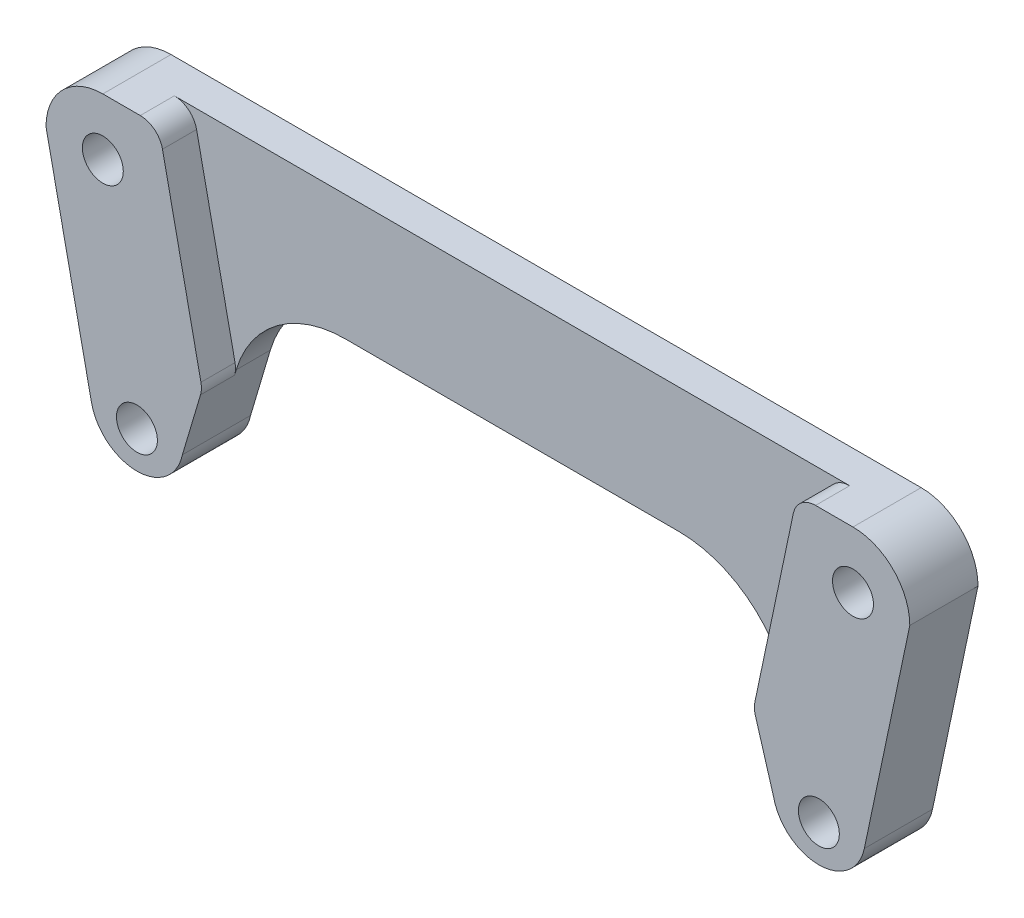
ISO-10303-21;
HEADER;
FILE_DESCRIPTION(('STEP AP214'),'2;1');
FILE_NAME('part.step','',(''),(''),'','','');
FILE_SCHEMA(('AUTOMOTIVE_DESIGN { 1 0 10303 214 1 1 1 1 }'));
ENDSEC;
DATA;
#1=APPLICATION_CONTEXT('core data for automotive mechanical design processes');
#2=APPLICATION_PROTOCOL_DEFINITION('international standard','automotive_design',2000,#1);
#3=PRODUCT_CONTEXT('',#1,'mechanical');
#4=PRODUCT('Part','Part','',(#3));
#5=PRODUCT_RELATED_PRODUCT_CATEGORY('part','',(#4));
#6=PRODUCT_DEFINITION_FORMATION('','',#4);
#7=PRODUCT_DEFINITION_CONTEXT('part definition',#1,'design');
#8=PRODUCT_DEFINITION('design','',#6,#7);
#9=PRODUCT_DEFINITION_SHAPE('','',#8);
#10=(LENGTH_UNIT() NAMED_UNIT(*) SI_UNIT(.MILLI.,.METRE.));
#11=(NAMED_UNIT(*) PLANE_ANGLE_UNIT() SI_UNIT($,.RADIAN.));
#12=(NAMED_UNIT(*) SI_UNIT($,.STERADIAN.) SOLID_ANGLE_UNIT());
#13=UNCERTAINTY_MEASURE_WITH_UNIT(LENGTH_MEASURE(1.E-05),#10,'distance_accuracy_value','');
#14=(GEOMETRIC_REPRESENTATION_CONTEXT(3) GLOBAL_UNCERTAINTY_ASSIGNED_CONTEXT((#13)) GLOBAL_UNIT_ASSIGNED_CONTEXT((#10,
#11,#12)) REPRESENTATION_CONTEXT('',''));
#15=CARTESIAN_POINT('',(0.,0.,0.));
#16=DIRECTION('',(0.,0.,1.));
#17=DIRECTION('',(1.,0.,0.));
#18=AXIS2_PLACEMENT_3D('',#15,#16,#17);
#19=CARTESIAN_POINT('',(-68.8008162556196,40.1897466086375,6.));
#20=DIRECTION('',(0.,0.,1.));
#21=DIRECTION('',(1.,0.,0.));
#22=AXIS2_PLACEMENT_3D('',#19,#20,#21);
#23=PLANE('',#22);
#24=DIRECTION('',(0.28471991780925,0.958610749158747,0.));
#25=VECTOR('',#24,1.);
#26=CARTESIAN_POINT('',(-61.8008162556196,21.1897466086375,6.));
#27=LINE('',#26,#25);
#28=CARTESIAN_POINT('',(-61.8008162556196,21.1897466086375,6.));
#29=VERTEX_POINT('',#28);
#30=CARTESIAN_POINT('',(-60.208374812723,26.5512664359551,6.));
#31=VERTEX_POINT('',#30);
#32=EDGE_CURVE('E409',#29,#31,#27,.T.);
#33=ORIENTED_EDGE('',*,*,#32,.T.);
#34=CARTESIAN_POINT('',(-62.1255963110405,27.1207062715736,6.));
#35=DIRECTION('',(0.,0.,1.));
#36=DIRECTION('',(1.,0.,0.));
#37=AXIS2_PLACEMENT_3D('',#34,#35,#36);
#38=CIRCLE('',#37,2.);
#39=CARTESIAN_POINT('',(-60.168496741067,27.5327272336733,6.));
#40=VERTEX_POINT('',#39);
#41=EDGE_CURVE('E267',#31,#40,#38,.T.);
#42=ORIENTED_EDGE('',*,*,#41,.T.);
#43=DIRECTION('',(0.20601048104984,-0.978549784986749,0.));
#44=VECTOR('',#43,1.);
#45=CARTESIAN_POINT('',(-60.0641216996053,27.03694578673,6.));
#46=LINE('',#45,#44);
#47=CARTESIAN_POINT('',(-63.5514526015015,43.6017675707372,6.));
#48=VERTEX_POINT('',#47);
#49=EDGE_CURVE('E449',#48,#40,#46,.T.);
#50=ORIENTED_EDGE('',*,*,#49,.F.);
#51=CARTESIAN_POINT('',(-65.508552171475,43.1897466086375,6.));
#52=DIRECTION('',(0.,0.,1.));
#53=DIRECTION('',(1.,0.,0.));
#54=AXIS2_PLACEMENT_3D('',#51,#52,#53);
#55=CIRCLE('',#54,2.);
#56=CARTESIAN_POINT('',(-65.508552171475,45.1897466086375,6.));
#57=VERTEX_POINT('',#56);
#58=EDGE_CURVE('E264',#48,#57,#55,.T.);
#59=ORIENTED_EDGE('',*,*,#58,.T.);
#60=DIRECTION('',(-1.,0.,0.));
#61=VECTOR('',#60,1.);
#62=CARTESIAN_POINT('',(-68.8008162556196,45.1897466086375,6.));
#63=LINE('',#62,#61);
#64=CARTESIAN_POINT('',(-68.8008162556196,45.1897466086375,6.));
#65=VERTEX_POINT('',#64);
#66=EDGE_CURVE('E305',#57,#65,#63,.T.);
#67=ORIENTED_EDGE('',*,*,#66,.T.);
#68=CARTESIAN_POINT('',(-68.8008162556196,40.1897466086375,6.));
#69=DIRECTION('',(0.,0.,1.));
#70=DIRECTION('',(1.,0.,0.));
#71=AXIS2_PLACEMENT_3D('',#68,#69,#70);
#72=CIRCLE('',#71,4.99999999999998);
#73=CARTESIAN_POINT('',(-73.8008162556196,40.1897466086375,6.));
#74=VERTEX_POINT('',#73);
#75=EDGE_CURVE('E354',#65,#74,#72,.T.);
#76=ORIENTED_EDGE('',*,*,#75,.T.);
#77=DIRECTION('',(0.206010481049839,-0.97854978498675,0.));
#78=VECTOR('',#77,1.);
#79=CARTESIAN_POINT('',(-73.8008162556196,40.1897466086375,6.));
#80=LINE('',#79,#78);
#81=CARTESIAN_POINT('',(-69.8008162556196,21.1897466086375,6.));
#82=VERTEX_POINT('',#81);
#83=EDGE_CURVE('E393',#74,#82,#80,.T.);
#84=ORIENTED_EDGE('',*,*,#83,.T.);
#85=CARTESIAN_POINT('',(-65.8008162556196,22.0318518717954,6.));
#86=DIRECTION('',(0.,0.,1.));
#87=DIRECTION('',(1.,0.,0.));
#88=AXIS2_PLACEMENT_3D('',#85,#86,#87);
#89=CIRCLE('',#88,4.08768165030476);
#90=EDGE_CURVE('E397',#82,#29,#89,.T.);
#91=ORIENTED_EDGE('',*,*,#90,.T.);
#92=EDGE_LOOP('',(#33,#42,#50,#59,#67,#76,#84,#91));
#93=FACE_BOUND('',#92,.T.);
#94=CARTESIAN_POINT('',(-65.8008162556196,21.1897466086375,6.));
#95=DIRECTION('',(0.,0.,1.));
#96=DIRECTION('',(1.,0.,0.));
#97=AXIS2_PLACEMENT_3D('',#94,#95,#96);
#98=CIRCLE('',#97,1.80000000000001);
#99=CARTESIAN_POINT('',(-64.0008162556196,21.1897466086375,6.));
#100=VERTEX_POINT('',#99);
#101=EDGE_CURVE('E484',#100,#100,#98,.T.);
#102=ORIENTED_EDGE('',*,*,#101,.F.);
#103=EDGE_LOOP('',(#102));
#104=FACE_BOUND('',#103,.T.);
#105=CARTESIAN_POINT('',(-68.8008162556196,40.1897466086375,6.));
#106=DIRECTION('',(0.,0.,1.));
#107=DIRECTION('',(1.,0.,0.));
#108=AXIS2_PLACEMENT_3D('',#105,#106,#107);
#109=CIRCLE('',#108,1.80000000000001);
#110=CARTESIAN_POINT('',(-67.0008162556196,40.1897466086375,6.));
#111=VERTEX_POINT('',#110);
#112=EDGE_CURVE('E320',#111,#111,#109,.T.);
#113=ORIENTED_EDGE('',*,*,#112,.F.);
#114=EDGE_LOOP('',(#113));
#115=FACE_BOUND('',#114,.T.);
#116=ADVANCED_FACE('F45',(#93,#104,#115),#23,.T.);
#117=DIRECTION('',(0.206010481049842,0.978549784986749,0.));
#118=VECTOR('',#117,1.);
#119=CARTESIAN_POINT('',(-11.5375108116339,27.03694578673,6.));
#120=LINE('',#119,#118);
#121=CARTESIAN_POINT('',(-11.4331357701722,27.5327272336733,6.));
#122=VERTEX_POINT('',#121);
#123=CARTESIAN_POINT('',(-8.05017990973769,43.6017675707372,6.));
#124=VERTEX_POINT('',#123);
#125=EDGE_CURVE('E452',#122,#124,#120,.T.);
#126=ORIENTED_EDGE('',*,*,#125,.F.);
#127=CARTESIAN_POINT('',(-9.47603620019871,27.1207062715736,6.));
#128=DIRECTION('',(0.,0.,1.));
#129=DIRECTION('',(1.,0.,0.));
#130=AXIS2_PLACEMENT_3D('',#127,#128,#129);
#131=CIRCLE('',#130,2.);
#132=CARTESIAN_POINT('',(-11.3932576985162,26.5512664359551,6.));
#133=VERTEX_POINT('',#132);
#134=EDGE_CURVE('E248',#122,#133,#131,.T.);
#135=ORIENTED_EDGE('',*,*,#134,.T.);
#136=DIRECTION('',(0.28471991780925,-0.958610749158747,0.));
#137=VECTOR('',#136,1.);
#138=CARTESIAN_POINT('',(-11.5375108116339,27.03694578673,6.));
#139=LINE('',#138,#137);
#140=CARTESIAN_POINT('',(-9.80081625561963,21.1897466086375,6.));
#141=VERTEX_POINT('',#140);
#142=EDGE_CURVE('E412',#133,#141,#139,.T.);
#143=ORIENTED_EDGE('',*,*,#142,.T.);
#144=CARTESIAN_POINT('',(-5.80081625561962,22.0318518717954,6.));
#145=DIRECTION('',(0.,0.,1.));
#146=DIRECTION('',(-1.,0.,0.));
#147=AXIS2_PLACEMENT_3D('',#144,#145,#146);
#148=CIRCLE('',#147,4.08768165030476);
#149=CARTESIAN_POINT('',(-1.80081625561962,21.1897466086375,6.));
#150=VERTEX_POINT('',#149);
#151=EDGE_CURVE('E415',#141,#150,#148,.T.);
#152=ORIENTED_EDGE('',*,*,#151,.T.);
#153=DIRECTION('',(0.206010481049842,0.978549784986749,0.));
#154=VECTOR('',#153,1.);
#155=CARTESIAN_POINT('',(2.19918374438038,40.1897466086375,6.));
#156=LINE('',#155,#154);
#157=CARTESIAN_POINT('',(2.19918374438038,40.1897466086375,6.));
#158=VERTEX_POINT('',#157);
#159=EDGE_CURVE('E369',#150,#158,#156,.T.);
#160=ORIENTED_EDGE('',*,*,#159,.T.);
#161=CARTESIAN_POINT('',(-2.80081625561962,40.1897466086375,6.));
#162=DIRECTION('',(0.,0.,1.));
#163=DIRECTION('',(-1.,0.,0.));
#164=AXIS2_PLACEMENT_3D('',#161,#162,#163);
#165=CIRCLE('',#164,5.);
#166=CARTESIAN_POINT('',(-2.80081625561962,45.1897466086375,6.));
#167=VERTEX_POINT('',#166);
#168=EDGE_CURVE('E301',#158,#167,#165,.T.);
#169=ORIENTED_EDGE('',*,*,#168,.T.);
#170=CARTESIAN_POINT('',(-6.0930803397642,45.1897466086375,6.));
#171=VERTEX_POINT('',#170);
#172=EDGE_CURVE('E294',#167,#171,#63,.T.);
#173=ORIENTED_EDGE('',*,*,#172,.T.);
#174=CARTESIAN_POINT('',(-6.0930803397642,43.1897466086375,6.));
#175=DIRECTION('',(0.,0.,1.));
#176=DIRECTION('',(1.,0.,0.));
#177=AXIS2_PLACEMENT_3D('',#174,#175,#176);
#178=CIRCLE('',#177,2.);
#179=EDGE_CURVE('E245',#171,#124,#178,.T.);
#180=ORIENTED_EDGE('',*,*,#179,.T.);
#181=EDGE_LOOP('',(#126,#135,#143,#152,#160,#169,#173,#180));
#182=FACE_BOUND('',#181,.T.);
#183=CARTESIAN_POINT('',(-5.80081625561962,21.1897466086375,6.));
#184=DIRECTION('',(0.,0.,1.));
#185=DIRECTION('',(1.,0.,0.));
#186=AXIS2_PLACEMENT_3D('',#183,#184,#185);
#187=CIRCLE('',#186,1.80000000000007);
#188=CARTESIAN_POINT('',(-4.00081625561956,21.1897466086375,6.));
#189=VERTEX_POINT('',#188);
#190=EDGE_CURVE('E476',#189,#189,#187,.T.);
#191=ORIENTED_EDGE('',*,*,#190,.F.);
#192=EDGE_LOOP('',(#191));
#193=FACE_BOUND('',#192,.T.);
#194=CARTESIAN_POINT('',(-2.80081625561962,40.1897466086375,6.));
#195=DIRECTION('',(0.,0.,1.));
#196=DIRECTION('',(1.,0.,0.));
#197=AXIS2_PLACEMENT_3D('',#194,#195,#196);
#198=CIRCLE('',#197,1.80000000000001);
#199=CARTESIAN_POINT('',(-1.00081625561961,40.1897466086375,6.));
#200=VERTEX_POINT('',#199);
#201=EDGE_CURVE('E468',#200,#200,#198,.T.);
#202=ORIENTED_EDGE('',*,*,#201,.F.);
#203=EDGE_LOOP('',(#202));
#204=FACE_BOUND('',#203,.T.);
#205=ADVANCED_FACE('F297',(#182,#193,#204),#23,.T.);
#206=CARTESIAN_POINT('',(-68.8008162556196,40.1897466086375,0.));
#207=DIRECTION('',(0.,0.,1.));
#208=DIRECTION('',(1.,0.,0.));
#209=AXIS2_PLACEMENT_3D('',#206,#207,#208);
#210=PLANE('',#209);
#211=CARTESIAN_POINT('',(-68.8008162556196,40.1897466086375,0.));
#212=DIRECTION('',(0.,0.,1.));
#213=DIRECTION('',(1.,0.,0.));
#214=AXIS2_PLACEMENT_3D('',#211,#212,#213);
#215=CIRCLE('',#214,4.99999999999998);
#216=CARTESIAN_POINT('',(-68.8008162556196,45.1897466086375,0.));
#217=VERTEX_POINT('',#216);
#218=CARTESIAN_POINT('',(-73.8008162556196,40.1897466086375,0.));
#219=VERTEX_POINT('',#218);
#220=EDGE_CURVE('E315',#217,#219,#215,.T.);
#221=ORIENTED_EDGE('',*,*,#220,.F.);
#222=DIRECTION('',(-1.,0.,0.));
#223=VECTOR('',#222,1.);
#224=CARTESIAN_POINT('',(-68.8008162556196,45.1897466086375,0.));
#225=LINE('',#224,#223);
#226=CARTESIAN_POINT('',(-2.80081625561962,45.1897466086375,0.));
#227=VERTEX_POINT('',#226);
#228=EDGE_CURVE('E352',#227,#217,#225,.T.);
#229=ORIENTED_EDGE('',*,*,#228,.F.);
#230=CARTESIAN_POINT('',(-2.80081625561962,40.1897466086375,0.));
#231=DIRECTION('',(0.,0.,1.));
#232=DIRECTION('',(-1.,0.,0.));
#233=AXIS2_PLACEMENT_3D('',#230,#231,#232);
#234=CIRCLE('',#233,5.);
#235=CARTESIAN_POINT('',(2.19918374438038,40.1897466086375,0.));
#236=VERTEX_POINT('',#235);
#237=EDGE_CURVE('E349',#236,#227,#234,.T.);
#238=ORIENTED_EDGE('',*,*,#237,.F.);
#239=DIRECTION('',(0.206010481049842,0.978549784986749,0.));
#240=VECTOR('',#239,1.);
#241=CARTESIAN_POINT('',(2.19918374438038,40.1897466086375,0.));
#242=LINE('',#241,#240);
#243=CARTESIAN_POINT('',(-1.80081625561962,21.1897466086375,0.));
#244=VERTEX_POINT('',#243);
#245=EDGE_CURVE('E346',#244,#236,#242,.T.);
#246=ORIENTED_EDGE('',*,*,#245,.F.);
#247=CARTESIAN_POINT('',(-5.80081625561962,22.0318518717954,0.));
#248=DIRECTION('',(0.,0.,1.));
#249=DIRECTION('',(-1.,0.,0.));
#250=AXIS2_PLACEMENT_3D('',#247,#248,#249);
#251=CIRCLE('',#250,4.08768165030476);
#252=CARTESIAN_POINT('',(-9.80081625561963,21.1897466086375,0.));
#253=VERTEX_POINT('',#252);
#254=EDGE_CURVE('E343',#253,#244,#251,.T.);
#255=ORIENTED_EDGE('',*,*,#254,.F.);
#256=DIRECTION('',(0.28471991780925,-0.958610749158747,0.));
#257=VECTOR('',#256,1.);
#258=CARTESIAN_POINT('',(-11.5375108116339,27.03694578673,0.));
#259=LINE('',#258,#257);
#260=CARTESIAN_POINT('',(-11.5375108116339,27.03694578673,0.));
#261=VERTEX_POINT('',#260);
#262=EDGE_CURVE('E340',#261,#253,#259,.T.);
#263=ORIENTED_EDGE('',*,*,#262,.F.);
#264=CARTESIAN_POINT('',(-21.1236183032214,24.1897466086375,0.));
#265=DIRECTION('',(0.,0.,-1.));
#266=DIRECTION('',(1.,0.,0.));
#267=AXIS2_PLACEMENT_3D('',#264,#265,#266);
#268=CIRCLE('',#267,10.);
#269=CARTESIAN_POINT('',(-21.1236183032214,34.1897466086375,0.));
#270=VERTEX_POINT('',#269);
#271=EDGE_CURVE('E206',#270,#261,#268,.T.);
#272=ORIENTED_EDGE('',*,*,#271,.F.);
#273=DIRECTION('',(1.,0.,0.));
#274=VECTOR('',#273,1.);
#275=CARTESIAN_POINT('',(-21.1236183032214,34.1897466086375,0.));
#276=LINE('',#275,#274);
#277=CARTESIAN_POINT('',(-50.4780142080178,34.1897466086375,0.));
#278=VERTEX_POINT('',#277);
#279=EDGE_CURVE('E334',#278,#270,#276,.T.);
#280=ORIENTED_EDGE('',*,*,#279,.F.);
#281=CARTESIAN_POINT('',(-50.4780142080178,24.1897466086375,0.));
#282=DIRECTION('',(0.,0.,-1.));
#283=DIRECTION('',(-1.,0.,0.));
#284=AXIS2_PLACEMENT_3D('',#281,#282,#283);
#285=CIRCLE('',#284,10.);
#286=CARTESIAN_POINT('',(-60.0641216996053,27.03694578673,0.));
#287=VERTEX_POINT('',#286);
#288=EDGE_CURVE('E330',#287,#278,#285,.T.);
#289=ORIENTED_EDGE('',*,*,#288,.F.);
#290=DIRECTION('',(0.28471991780925,0.958610749158747,0.));
#291=VECTOR('',#290,1.);
#292=CARTESIAN_POINT('',(-61.8008162556196,21.1897466086375,0.));
#293=LINE('',#292,#291);
#294=CARTESIAN_POINT('',(-61.8008162556196,21.1897466086375,0.));
#295=VERTEX_POINT('',#294);
#296=EDGE_CURVE('E326',#295,#287,#293,.T.);
#297=ORIENTED_EDGE('',*,*,#296,.F.);
#298=CARTESIAN_POINT('',(-65.8008162556196,22.0318518717954,0.));
#299=DIRECTION('',(0.,0.,1.));
#300=DIRECTION('',(1.,0.,0.));
#301=AXIS2_PLACEMENT_3D('',#298,#299,#300);
#302=CIRCLE('',#301,4.08768165030476);
#303=CARTESIAN_POINT('',(-69.8008162556196,21.1897466086375,0.));
#304=VERTEX_POINT('',#303);
#305=EDGE_CURVE('E323',#304,#295,#302,.T.);
#306=ORIENTED_EDGE('',*,*,#305,.F.);
#307=DIRECTION('',(0.206010481049839,-0.97854978498675,0.));
#308=VECTOR('',#307,1.);
#309=CARTESIAN_POINT('',(-73.8008162556196,40.1897466086375,0.));
#310=LINE('',#309,#308);
#311=EDGE_CURVE('E319',#219,#304,#310,.T.);
#312=ORIENTED_EDGE('',*,*,#311,.F.);
#313=EDGE_LOOP('',(#221,#229,#238,#246,#255,#263,#272,#280,#289,#297,#306,#312));
#314=FACE_BOUND('',#313,.T.);
#315=CARTESIAN_POINT('',(-68.8008162556196,40.1897466086375,0.));
#316=DIRECTION('',(0.,0.,1.));
#317=DIRECTION('',(1.,0.,0.));
#318=AXIS2_PLACEMENT_3D('',#315,#316,#317);
#319=CIRCLE('',#318,1.80000000000001);
#320=CARTESIAN_POINT('',(-67.0008162556196,40.1897466086375,0.));
#321=VERTEX_POINT('',#320);
#322=EDGE_CURVE('E404',#321,#321,#319,.T.);
#323=ORIENTED_EDGE('',*,*,#322,.T.);
#324=EDGE_LOOP('',(#323));
#325=FACE_BOUND('',#324,.T.);
#326=CARTESIAN_POINT('',(-65.8008162556196,21.1897466086375,0.));
#327=DIRECTION('',(0.,0.,1.));
#328=DIRECTION('',(1.,0.,0.));
#329=AXIS2_PLACEMENT_3D('',#326,#327,#328);
#330=CIRCLE('',#329,1.80000000000001);
#331=CARTESIAN_POINT('',(-64.0008162556196,21.1897466086375,0.));
#332=VERTEX_POINT('',#331);
#333=EDGE_CURVE('E480',#332,#332,#330,.T.);
#334=ORIENTED_EDGE('',*,*,#333,.T.);
#335=EDGE_LOOP('',(#334));
#336=FACE_BOUND('',#335,.T.);
#337=CARTESIAN_POINT('',(-5.80081625561962,21.1897466086375,0.));
#338=DIRECTION('',(0.,0.,1.));
#339=DIRECTION('',(1.,0.,0.));
#340=AXIS2_PLACEMENT_3D('',#337,#338,#339);
#341=CIRCLE('',#340,1.80000000000007);
#342=CARTESIAN_POINT('',(-4.00081625561956,21.1897466086375,0.));
#343=VERTEX_POINT('',#342);
#344=EDGE_CURVE('E472',#343,#343,#341,.T.);
#345=ORIENTED_EDGE('',*,*,#344,.T.);
#346=EDGE_LOOP('',(#345));
#347=FACE_BOUND('',#346,.T.);
#348=CARTESIAN_POINT('',(-2.80081625561962,40.1897466086375,0.));
#349=DIRECTION('',(0.,0.,1.));
#350=DIRECTION('',(1.,0.,0.));
#351=AXIS2_PLACEMENT_3D('',#348,#349,#350);
#352=CIRCLE('',#351,1.80000000000001);
#353=CARTESIAN_POINT('',(-1.00081625561961,40.1897466086375,0.));
#354=VERTEX_POINT('',#353);
#355=EDGE_CURVE('E467',#354,#354,#352,.T.);
#356=ORIENTED_EDGE('',*,*,#355,.T.);
#357=EDGE_LOOP('',(#356));
#358=FACE_BOUND('',#357,.T.);
#359=ADVANCED_FACE('F376',(#314,#325,#336,#347,#358),#210,.F.);
#360=CARTESIAN_POINT('',(-68.8008162556196,40.1897466086375,6.));
#361=DIRECTION('',(0.,0.,-1.));
#362=DIRECTION('',(-1.,0.,0.));
#363=AXIS2_PLACEMENT_3D('',#360,#361,#362);
#364=CYLINDRICAL_SURFACE('',#363,4.99999999999998);
#365=ORIENTED_EDGE('',*,*,#220,.T.);
#366=DIRECTION('',(0.,0.,-1.));
#367=VECTOR('',#366,1.);
#368=CARTESIAN_POINT('',(-73.8008162556196,40.1897466086375,6.));
#369=LINE('',#368,#367);
#370=EDGE_CURVE('E193',#74,#219,#369,.T.);
#371=ORIENTED_EDGE('',*,*,#370,.F.);
#372=ORIENTED_EDGE('',*,*,#75,.F.);
#373=DIRECTION('',(0.,0.,-1.));
#374=VECTOR('',#373,1.);
#375=CARTESIAN_POINT('',(-68.8008162556196,45.1897466086375,6.));
#376=LINE('',#375,#374);
#377=EDGE_CURVE('E304',#65,#217,#376,.T.);
#378=ORIENTED_EDGE('',*,*,#377,.T.);
#379=EDGE_LOOP('',(#365,#371,#372,#378));
#380=FACE_BOUND('',#379,.T.);
#381=ADVANCED_FACE('F385',(#380),#364,.T.);
#382=CARTESIAN_POINT('',(-73.8008162556196,40.1897466086375,6.));
#383=DIRECTION('',(0.978549784986749,0.206010481049839,0.));
#384=DIRECTION('',(-0.206010481049839,0.97854978498675,0.));
#385=AXIS2_PLACEMENT_3D('',#382,#383,#384);
#386=PLANE('',#385);
#387=ORIENTED_EDGE('',*,*,#311,.T.);
#388=DIRECTION('',(0.,0.,-1.));
#389=VECTOR('',#388,1.);
#390=CARTESIAN_POINT('',(-69.8008162556196,21.1897466086375,6.));
#391=LINE('',#390,#389);
#392=EDGE_CURVE('E230',#82,#304,#391,.T.);
#393=ORIENTED_EDGE('',*,*,#392,.F.);
#394=ORIENTED_EDGE('',*,*,#83,.F.);
#395=ORIENTED_EDGE('',*,*,#370,.T.);
#396=EDGE_LOOP('',(#387,#393,#394,#395));
#397=FACE_BOUND('',#396,.T.);
#398=ADVANCED_FACE('F392',(#397),#386,.F.);
#399=CARTESIAN_POINT('',(-65.8008162556196,22.0318518717954,6.));
#400=DIRECTION('',(0.,0.,-1.));
#401=DIRECTION('',(-1.,0.,0.));
#402=AXIS2_PLACEMENT_3D('',#399,#400,#401);
#403=CYLINDRICAL_SURFACE('',#402,4.08768165030476);
#404=ORIENTED_EDGE('',*,*,#305,.T.);
#405=DIRECTION('',(0.,0.,-1.));
#406=VECTOR('',#405,1.);
#407=CARTESIAN_POINT('',(-61.8008162556196,21.1897466086375,6.));
#408=LINE('',#407,#406);
#409=EDGE_CURVE('E226',#29,#295,#408,.T.);
#410=ORIENTED_EDGE('',*,*,#409,.F.);
#411=ORIENTED_EDGE('',*,*,#90,.F.);
#412=ORIENTED_EDGE('',*,*,#392,.T.);
#413=EDGE_LOOP('',(#404,#410,#411,#412));
#414=FACE_BOUND('',#413,.T.);
#415=ADVANCED_FACE('F435',(#414),#403,.T.);
#416=CARTESIAN_POINT('',(-61.8008162556196,21.1897466086375,6.));
#417=DIRECTION('',(-0.958610749158747,0.28471991780925,0.));
#418=DIRECTION('',(-0.28471991780925,-0.958610749158747,0.));
#419=AXIS2_PLACEMENT_3D('',#416,#417,#418);
#420=PLANE('',#419);
#421=DIRECTION('',(0.,0.,-1.));
#422=VECTOR('',#421,1.);
#423=CARTESIAN_POINT('',(-60.0641216996053,27.03694578673,6.));
#424=LINE('',#423,#422);
#425=CARTESIAN_POINT('',(-60.0641216996053,27.03694578673,3.));
#426=VERTEX_POINT('',#425);
#427=EDGE_CURVE('E223',#426,#287,#424,.T.);
#428=ORIENTED_EDGE('',*,*,#427,.F.);
#429=DIRECTION('',(-0.28471991780925,-0.958610749158747,0.));
#430=VECTOR('',#429,1.);
#431=CARTESIAN_POINT('',(-61.8008162556196,21.1897466086375,3.));
#432=LINE('',#431,#430);
#433=CARTESIAN_POINT('',(-60.208374812723,26.5512664359551,3.));
#434=VERTEX_POINT('',#433);
#435=EDGE_CURVE('E61',#426,#434,#432,.T.);
#436=ORIENTED_EDGE('',*,*,#435,.T.);
#437=DIRECTION('',(0.,0.,-1.));
#438=VECTOR('',#437,1.);
#439=CARTESIAN_POINT('',(-60.208374812723,26.5512664359551,6.));
#440=LINE('',#439,#438);
#441=EDGE_CURVE('E259',#434,#31,#440,.F.);
#442=ORIENTED_EDGE('',*,*,#441,.T.);
#443=ORIENTED_EDGE('',*,*,#32,.F.);
#444=ORIENTED_EDGE('',*,*,#409,.T.);
#445=ORIENTED_EDGE('',*,*,#296,.T.);
#446=EDGE_LOOP('',(#428,#436,#442,#443,#444,#445));
#447=FACE_BOUND('',#446,.T.);
#448=ADVANCED_FACE('F431',(#447),#420,.F.);
#449=CARTESIAN_POINT('',(-50.4780142080178,24.1897466086375,6.));
#450=DIRECTION('',(0.,0.,-1.));
#451=DIRECTION('',(-1.,0.,0.));
#452=AXIS2_PLACEMENT_3D('',#449,#450,#451);
#453=CYLINDRICAL_SURFACE('',#452,10.);
#454=DIRECTION('',(0.,0.,-1.));
#455=VECTOR('',#454,1.);
#456=CARTESIAN_POINT('',(-50.4780142080178,34.1897466086375,6.));
#457=LINE('',#456,#455);
#458=CARTESIAN_POINT('',(-50.4780142080178,34.1897466086375,3.));
#459=VERTEX_POINT('',#458);
#460=EDGE_CURVE('E214',#459,#278,#457,.T.);
#461=ORIENTED_EDGE('',*,*,#460,.F.);
#462=CARTESIAN_POINT('',(-50.4780142080178,24.1897466086375,3.));
#463=DIRECTION('',(0.,0.,-1.));
#464=DIRECTION('',(-1.,0.,0.));
#465=AXIS2_PLACEMENT_3D('',#462,#463,#464);
#466=CIRCLE('',#465,10.);
#467=EDGE_CURVE('E429',#459,#426,#466,.F.);
#468=ORIENTED_EDGE('',*,*,#467,.T.);
#469=ORIENTED_EDGE('',*,*,#427,.T.);
#470=ORIENTED_EDGE('',*,*,#288,.T.);
#471=EDGE_LOOP('',(#461,#468,#469,#470));
#472=FACE_BOUND('',#471,.T.);
#473=ADVANCED_FACE('F428',(#472),#453,.F.);
#474=CARTESIAN_POINT('',(-21.1236183032214,34.1897466086375,6.));
#475=DIRECTION('',(0.,1.,0.));
#476=DIRECTION('',(0.,0.,1.));
#477=AXIS2_PLACEMENT_3D('',#474,#475,#476);
#478=PLANE('',#477);
#479=DIRECTION('',(0.,0.,-1.));
#480=VECTOR('',#479,1.);
#481=CARTESIAN_POINT('',(-21.1236183032214,34.1897466086375,6.));
#482=LINE('',#481,#480);
#483=CARTESIAN_POINT('',(-21.1236183032214,34.1897466086375,3.));
#484=VERTEX_POINT('',#483);
#485=EDGE_CURVE('E209',#484,#270,#482,.T.);
#486=ORIENTED_EDGE('',*,*,#485,.F.);
#487=DIRECTION('',(-1.,0.,0.));
#488=VECTOR('',#487,1.);
#489=CARTESIAN_POINT('',(-21.1236183032214,34.1897466086375,3.));
#490=LINE('',#489,#488);
#491=EDGE_CURVE('E199',#484,#459,#490,.T.);
#492=ORIENTED_EDGE('',*,*,#491,.T.);
#493=ORIENTED_EDGE('',*,*,#460,.T.);
#494=ORIENTED_EDGE('',*,*,#279,.T.);
#495=EDGE_LOOP('',(#486,#492,#493,#494));
#496=FACE_BOUND('',#495,.T.);
#497=ADVANCED_FACE('F424',(#496),#478,.F.);
#498=CARTESIAN_POINT('',(-21.1236183032214,24.1897466086375,6.));
#499=DIRECTION('',(0.,0.,-1.));
#500=DIRECTION('',(-1.,0.,0.));
#501=AXIS2_PLACEMENT_3D('',#498,#499,#500);
#502=CYLINDRICAL_SURFACE('',#501,10.);
#503=DIRECTION('',(0.,0.,-1.));
#504=VECTOR('',#503,1.);
#505=CARTESIAN_POINT('',(-11.5375108116339,27.03694578673,6.));
#506=LINE('',#505,#504);
#507=CARTESIAN_POINT('',(-11.5375108116339,27.03694578673,3.));
#508=VERTEX_POINT('',#507);
#509=EDGE_CURVE('E188',#508,#261,#506,.T.);
#510=ORIENTED_EDGE('',*,*,#509,.F.);
#511=CARTESIAN_POINT('',(-21.1236183032214,24.1897466086375,3.));
#512=DIRECTION('',(0.,0.,-1.));
#513=DIRECTION('',(-1.,0.,0.));
#514=AXIS2_PLACEMENT_3D('',#511,#512,#513);
#515=CIRCLE('',#514,10.);
#516=EDGE_CURVE('E196',#508,#484,#515,.F.);
#517=ORIENTED_EDGE('',*,*,#516,.T.);
#518=ORIENTED_EDGE('',*,*,#485,.T.);
#519=ORIENTED_EDGE('',*,*,#271,.T.);
#520=EDGE_LOOP('',(#510,#517,#518,#519));
#521=FACE_BOUND('',#520,.T.);
#522=ADVANCED_FACE('F204',(#521),#502,.F.);
#523=CARTESIAN_POINT('',(-11.5375108116339,27.03694578673,6.));
#524=DIRECTION('',(0.958610749158747,0.28471991780925,0.));
#525=DIRECTION('',(-0.28471991780925,0.958610749158747,0.));
#526=AXIS2_PLACEMENT_3D('',#523,#524,#525);
#527=PLANE('',#526);
#528=ORIENTED_EDGE('',*,*,#142,.F.);
#529=DIRECTION('',(0.,0.,-1.));
#530=VECTOR('',#529,1.);
#531=CARTESIAN_POINT('',(-11.3932576985162,26.5512664359551,6.));
#532=LINE('',#531,#530);
#533=CARTESIAN_POINT('',(-11.3932576985162,26.5512664359551,3.));
#534=VERTEX_POINT('',#533);
#535=EDGE_CURVE('E191',#133,#534,#532,.T.);
#536=ORIENTED_EDGE('',*,*,#535,.T.);
#537=DIRECTION('',(-0.28471991780925,0.958610749158747,0.));
#538=VECTOR('',#537,1.);
#539=CARTESIAN_POINT('',(-11.5375108116339,27.03694578673,3.));
#540=LINE('',#539,#538);
#541=EDGE_CURVE('E183',#534,#508,#540,.T.);
#542=ORIENTED_EDGE('',*,*,#541,.T.);
#543=ORIENTED_EDGE('',*,*,#509,.T.);
#544=ORIENTED_EDGE('',*,*,#262,.T.);
#545=DIRECTION('',(0.,0.,-1.));
#546=VECTOR('',#545,1.);
#547=CARTESIAN_POINT('',(-9.80081625561963,21.1897466086375,6.));
#548=LINE('',#547,#546);
#549=EDGE_CURVE('E210',#141,#253,#548,.T.);
#550=ORIENTED_EDGE('',*,*,#549,.F.);
#551=EDGE_LOOP('',(#528,#536,#542,#543,#544,#550));
#552=FACE_BOUND('',#551,.T.);
#553=ADVANCED_FACE('F186',(#552),#527,.F.);
#554=CARTESIAN_POINT('',(-5.80081625561962,22.0318518717954,6.));
#555=DIRECTION('',(0.,0.,-1.));
#556=DIRECTION('',(-1.,0.,0.));
#557=AXIS2_PLACEMENT_3D('',#554,#555,#556);
#558=CYLINDRICAL_SURFACE('',#557,4.08768165030476);
#559=ORIENTED_EDGE('',*,*,#254,.T.);
#560=DIRECTION('',(0.,0.,-1.));
#561=VECTOR('',#560,1.);
#562=CARTESIAN_POINT('',(-1.80081625561962,21.1897466086375,6.));
#563=LINE('',#562,#561);
#564=EDGE_CURVE('E217',#150,#244,#563,.T.);
#565=ORIENTED_EDGE('',*,*,#564,.F.);
#566=ORIENTED_EDGE('',*,*,#151,.F.);
#567=ORIENTED_EDGE('',*,*,#549,.T.);
#568=EDGE_LOOP('',(#559,#565,#566,#567));
#569=FACE_BOUND('',#568,.T.);
#570=ADVANCED_FACE('F420',(#569),#558,.T.);
#571=CARTESIAN_POINT('',(2.19918374438038,40.1897466086375,6.));
#572=DIRECTION('',(-0.978549784986749,0.206010481049842,0.));
#573=DIRECTION('',(-0.206010481049842,-0.978549784986749,0.));
#574=AXIS2_PLACEMENT_3D('',#571,#572,#573);
#575=PLANE('',#574);
#576=ORIENTED_EDGE('',*,*,#245,.T.);
#577=DIRECTION('',(0.,0.,-1.));
#578=VECTOR('',#577,1.);
#579=CARTESIAN_POINT('',(2.19918374438038,40.1897466086375,6.));
#580=LINE('',#579,#578);
#581=EDGE_CURVE('E358',#158,#236,#580,.T.);
#582=ORIENTED_EDGE('',*,*,#581,.F.);
#583=ORIENTED_EDGE('',*,*,#159,.F.);
#584=ORIENTED_EDGE('',*,*,#564,.T.);
#585=EDGE_LOOP('',(#576,#582,#583,#584));
#586=FACE_BOUND('',#585,.T.);
#587=ADVANCED_FACE('F367',(#586),#575,.F.);
#588=CARTESIAN_POINT('',(-2.80081625561962,40.1897466086375,6.));
#589=DIRECTION('',(0.,0.,-1.));
#590=DIRECTION('',(-1.,0.,0.));
#591=AXIS2_PLACEMENT_3D('',#588,#589,#590);
#592=CYLINDRICAL_SURFACE('',#591,5.);
#593=ORIENTED_EDGE('',*,*,#237,.T.);
#594=DIRECTION('',(0.,0.,-1.));
#595=VECTOR('',#594,1.);
#596=CARTESIAN_POINT('',(-2.80081625561962,45.1897466086375,6.));
#597=LINE('',#596,#595);
#598=EDGE_CURVE('E310',#167,#227,#597,.T.);
#599=ORIENTED_EDGE('',*,*,#598,.F.);
#600=ORIENTED_EDGE('',*,*,#168,.F.);
#601=ORIENTED_EDGE('',*,*,#581,.T.);
#602=EDGE_LOOP('',(#593,#599,#600,#601));
#603=FACE_BOUND('',#602,.T.);
#604=ADVANCED_FACE('F380',(#603),#592,.T.);
#605=CARTESIAN_POINT('',(-68.8008162556196,45.1897466086375,6.));
#606=DIRECTION('',(0.,-1.,0.));
#607=DIRECTION('',(0.,0.,-1.));
#608=AXIS2_PLACEMENT_3D('',#605,#606,#607);
#609=PLANE('',#608);
#610=DIRECTION('',(-1.,0.,0.));
#611=VECTOR('',#610,1.);
#612=CARTESIAN_POINT('',(-63.8857639779016,45.1897466086375,3.));
#613=LINE('',#612,#611);
#614=CARTESIAN_POINT('',(-6.09308033976422,45.1897466086375,3.));
#615=VERTEX_POINT('',#614);
#616=CARTESIAN_POINT('',(-65.508552171475,45.1897466086375,3.));
#617=VERTEX_POINT('',#616);
#618=EDGE_CURVE('E69',#615,#617,#613,.T.);
#619=ORIENTED_EDGE('',*,*,#618,.F.);
#620=DIRECTION('',(0.,0.,1.));
#621=VECTOR('',#620,1.);
#622=CARTESIAN_POINT('',(-6.0930803397642,45.1897466086375,6.));
#623=LINE('',#622,#621);
#624=EDGE_CURVE('E273',#615,#171,#623,.T.);
#625=ORIENTED_EDGE('',*,*,#624,.T.);
#626=ORIENTED_EDGE('',*,*,#172,.F.);
#627=ORIENTED_EDGE('',*,*,#598,.T.);
#628=ORIENTED_EDGE('',*,*,#228,.T.);
#629=ORIENTED_EDGE('',*,*,#377,.F.);
#630=ORIENTED_EDGE('',*,*,#66,.F.);
#631=DIRECTION('',(0.,0.,1.));
#632=VECTOR('',#631,1.);
#633=CARTESIAN_POINT('',(-65.508552171475,45.1897466086375,6.));
#634=LINE('',#633,#632);
#635=EDGE_CURVE('E270',#57,#617,#634,.F.);
#636=ORIENTED_EDGE('',*,*,#635,.T.);
#637=EDGE_LOOP('',(#619,#625,#626,#627,#628,#629,#630,#636));
#638=FACE_BOUND('',#637,.T.);
#639=ADVANCED_FACE('F292',(#638),#609,.F.);
#640=CARTESIAN_POINT('',(-68.8008162556196,40.1897466086375,6.));
#641=DIRECTION('',(0.,0.,-1.));
#642=DIRECTION('',(-1.,0.,0.));
#643=AXIS2_PLACEMENT_3D('',#640,#641,#642);
#644=CYLINDRICAL_SURFACE('',#643,1.80000000000001);
#645=ORIENTED_EDGE('',*,*,#112,.T.);
#646=EDGE_LOOP('',(#645));
#647=FACE_BOUND('',#646,.T.);
#648=ORIENTED_EDGE('',*,*,#322,.F.);
#649=EDGE_LOOP('',(#648));
#650=FACE_BOUND('',#649,.T.);
#651=ADVANCED_FACE('F499',(#647,#650),#644,.F.);
#652=CARTESIAN_POINT('',(-65.8008162556196,21.1897466086375,6.));
#653=DIRECTION('',(0.,0.,-1.));
#654=DIRECTION('',(-1.,0.,0.));
#655=AXIS2_PLACEMENT_3D('',#652,#653,#654);
#656=CYLINDRICAL_SURFACE('',#655,1.80000000000001);
#657=ORIENTED_EDGE('',*,*,#101,.T.);
#658=EDGE_LOOP('',(#657));
#659=FACE_BOUND('',#658,.T.);
#660=ORIENTED_EDGE('',*,*,#333,.F.);
#661=EDGE_LOOP('',(#660));
#662=FACE_BOUND('',#661,.T.);
#663=ADVANCED_FACE('F501',(#659,#662),#656,.F.);
#664=CARTESIAN_POINT('',(-5.80081625561962,21.1897466086375,6.));
#665=DIRECTION('',(0.,0.,-1.));
#666=DIRECTION('',(-1.,0.,0.));
#667=AXIS2_PLACEMENT_3D('',#664,#665,#666);
#668=CYLINDRICAL_SURFACE('',#667,1.80000000000007);
#669=ORIENTED_EDGE('',*,*,#190,.T.);
#670=EDGE_LOOP('',(#669));
#671=FACE_BOUND('',#670,.T.);
#672=ORIENTED_EDGE('',*,*,#344,.F.);
#673=EDGE_LOOP('',(#672));
#674=FACE_BOUND('',#673,.T.);
#675=ADVANCED_FACE('F507',(#671,#674),#668,.F.);
#676=CARTESIAN_POINT('',(-2.80081625561962,40.1897466086375,6.));
#677=DIRECTION('',(0.,0.,-1.));
#678=DIRECTION('',(-1.,0.,0.));
#679=AXIS2_PLACEMENT_3D('',#676,#677,#678);
#680=CYLINDRICAL_SURFACE('',#679,1.80000000000001);
#681=ORIENTED_EDGE('',*,*,#201,.T.);
#682=EDGE_LOOP('',(#681));
#683=FACE_BOUND('',#682,.T.);
#684=ORIENTED_EDGE('',*,*,#355,.F.);
#685=EDGE_LOOP('',(#684));
#686=FACE_BOUND('',#685,.T.);
#687=ADVANCED_FACE('F598',(#683,#686),#680,.F.);
#688=CARTESIAN_POINT('',(0.,0.,3.));
#689=DIRECTION('',(0.,0.,-1.));
#690=DIRECTION('',(-1.,0.,0.));
#691=AXIS2_PLACEMENT_3D('',#688,#689,#690);
#692=PLANE('',#691);
#693=ORIENTED_EDGE('',*,*,#491,.F.);
#694=ORIENTED_EDGE('',*,*,#516,.F.);
#695=ORIENTED_EDGE('',*,*,#541,.F.);
#696=CARTESIAN_POINT('',(-9.47603620019871,27.1207062715736,3.));
#697=DIRECTION('',(0.,0.,-1.));
#698=DIRECTION('',(-1.,0.,0.));
#699=AXIS2_PLACEMENT_3D('',#696,#697,#698);
#700=CIRCLE('',#699,2.);
#701=CARTESIAN_POINT('',(-11.4331357701722,27.5327272336733,3.));
#702=VERTEX_POINT('',#701);
#703=EDGE_CURVE('E276',#534,#702,#700,.T.);
#704=ORIENTED_EDGE('',*,*,#703,.T.);
#705=DIRECTION('',(0.206010481049842,0.978549784986749,0.));
#706=VECTOR('',#705,1.);
#707=CARTESIAN_POINT('',(-11.5375108116339,27.03694578673,3.));
#708=LINE('',#707,#706);
#709=CARTESIAN_POINT('',(-8.05017990973769,43.6017675707372,3.));
#710=VERTEX_POINT('',#709);
#711=EDGE_CURVE('E286',#702,#710,#708,.T.);
#712=ORIENTED_EDGE('',*,*,#711,.T.);
#713=CARTESIAN_POINT('',(-6.0930803397642,43.1897466086375,3.));
#714=DIRECTION('',(0.,0.,-1.));
#715=DIRECTION('',(-1.,0.,0.));
#716=AXIS2_PLACEMENT_3D('',#713,#714,#715);
#717=CIRCLE('',#716,2.);
#718=EDGE_CURVE('E54',#710,#615,#717,.T.);
#719=ORIENTED_EDGE('',*,*,#718,.T.);
#720=ORIENTED_EDGE('',*,*,#618,.T.);
#721=CARTESIAN_POINT('',(-65.508552171475,43.1897466086375,3.));
#722=DIRECTION('',(0.,0.,-1.));
#723=DIRECTION('',(-1.,0.,0.));
#724=AXIS2_PLACEMENT_3D('',#721,#722,#723);
#725=CIRCLE('',#724,2.);
#726=CARTESIAN_POINT('',(-63.5514526015015,43.6017675707372,3.));
#727=VERTEX_POINT('',#726);
#728=EDGE_CURVE('E11',#617,#727,#725,.T.);
#729=ORIENTED_EDGE('',*,*,#728,.T.);
#730=DIRECTION('',(0.20601048104984,-0.978549784986749,0.));
#731=VECTOR('',#730,1.);
#732=CARTESIAN_POINT('',(-60.0641216996053,27.03694578673,3.));
#733=LINE('',#732,#731);
#734=CARTESIAN_POINT('',(-60.168496741067,27.5327272336733,3.));
#735=VERTEX_POINT('',#734);
#736=EDGE_CURVE('E447',#727,#735,#733,.T.);
#737=ORIENTED_EDGE('',*,*,#736,.T.);
#738=CARTESIAN_POINT('',(-62.1255963110405,27.1207062715736,3.));
#739=DIRECTION('',(0.,0.,-1.));
#740=DIRECTION('',(-1.,0.,0.));
#741=AXIS2_PLACEMENT_3D('',#738,#739,#740);
#742=CIRCLE('',#741,2.);
#743=EDGE_CURVE('E279',#735,#434,#742,.T.);
#744=ORIENTED_EDGE('',*,*,#743,.T.);
#745=ORIENTED_EDGE('',*,*,#435,.F.);
#746=ORIENTED_EDGE('',*,*,#467,.F.);
#747=EDGE_LOOP('',(#693,#694,#695,#704,#712,#719,#720,#729,#737,#744,#745,#746));
#748=FACE_BOUND('',#747,.T.);
#749=ADVANCED_FACE('F197',(#748),#692,.F.);
#750=CARTESIAN_POINT('',(-60.0641216996053,27.03694578673,3.));
#751=DIRECTION('',(-0.978549784986749,-0.20601048104984,0.));
#752=DIRECTION('',(0.20601048104984,-0.978549784986749,0.));
#753=AXIS2_PLACEMENT_3D('',#750,#751,#752);
#754=PLANE('',#753);
#755=ORIENTED_EDGE('',*,*,#49,.T.);
#756=DIRECTION('',(0.,0.,-1.));
#757=VECTOR('',#756,1.);
#758=CARTESIAN_POINT('',(-60.168496741067,27.5327272336733,3.));
#759=LINE('',#758,#757);
#760=EDGE_CURVE('E255',#40,#735,#759,.T.);
#761=ORIENTED_EDGE('',*,*,#760,.T.);
#762=ORIENTED_EDGE('',*,*,#736,.F.);
#763=DIRECTION('',(0.,0.,1.));
#764=VECTOR('',#763,1.);
#765=CARTESIAN_POINT('',(-63.5514526015015,43.6017675707372,3.));
#766=LINE('',#765,#764);
#767=EDGE_CURVE('E251',#727,#48,#766,.T.);
#768=ORIENTED_EDGE('',*,*,#767,.T.);
#769=EDGE_LOOP('',(#755,#761,#762,#768));
#770=FACE_BOUND('',#769,.T.);
#771=ADVANCED_FACE('F446',(#770),#754,.F.);
#772=CARTESIAN_POINT('',(-11.5375108116339,27.03694578673,3.));
#773=DIRECTION('',(0.978549784986749,-0.206010481049842,0.));
#774=DIRECTION('',(0.206010481049842,0.978549784986749,0.));
#775=AXIS2_PLACEMENT_3D('',#772,#773,#774);
#776=PLANE('',#775);
#777=ORIENTED_EDGE('',*,*,#711,.F.);
#778=DIRECTION('',(0.,0.,-1.));
#779=VECTOR('',#778,1.);
#780=CARTESIAN_POINT('',(-11.4331357701722,27.5327272336733,3.));
#781=LINE('',#780,#779);
#782=EDGE_CURVE('E242',#702,#122,#781,.F.);
#783=ORIENTED_EDGE('',*,*,#782,.T.);
#784=ORIENTED_EDGE('',*,*,#125,.T.);
#785=DIRECTION('',(0.,0.,1.));
#786=VECTOR('',#785,1.);
#787=CARTESIAN_POINT('',(-8.0501799097377,43.6017675707372,3.));
#788=LINE('',#787,#786);
#789=EDGE_CURVE('E239',#124,#710,#788,.F.);
#790=ORIENTED_EDGE('',*,*,#789,.T.);
#791=EDGE_LOOP('',(#777,#783,#784,#790));
#792=FACE_BOUND('',#791,.T.);
#793=ADVANCED_FACE('F544',(#792),#776,.F.);
#794=CARTESIAN_POINT('',(-9.47603620019871,27.1207062715736,6.));
#795=DIRECTION('',(0.,0.,-1.));
#796=DIRECTION('',(-1.,0.,0.));
#797=AXIS2_PLACEMENT_3D('',#794,#795,#796);
#798=CYLINDRICAL_SURFACE('',#797,2.);
#799=ORIENTED_EDGE('',*,*,#134,.F.);
#800=ORIENTED_EDGE('',*,*,#782,.F.);
#801=ORIENTED_EDGE('',*,*,#703,.F.);
#802=ORIENTED_EDGE('',*,*,#535,.F.);
#803=EDGE_LOOP('',(#799,#800,#801,#802));
#804=FACE_BOUND('',#803,.T.);
#805=ADVANCED_FACE('F541',(#804),#798,.T.);
#806=CARTESIAN_POINT('',(-62.1255963110405,27.1207062715736,3.));
#807=DIRECTION('',(0.,0.,-1.));
#808=DIRECTION('',(-1.,0.,0.));
#809=AXIS2_PLACEMENT_3D('',#806,#807,#808);
#810=CYLINDRICAL_SURFACE('',#809,2.);
#811=ORIENTED_EDGE('',*,*,#41,.F.);
#812=ORIENTED_EDGE('',*,*,#441,.F.);
#813=ORIENTED_EDGE('',*,*,#743,.F.);
#814=ORIENTED_EDGE('',*,*,#760,.F.);
#815=EDGE_LOOP('',(#811,#812,#813,#814));
#816=FACE_BOUND('',#815,.T.);
#817=ADVANCED_FACE('F442',(#816),#810,.T.);
#818=CARTESIAN_POINT('',(-6.0930803397642,43.1897466086375,6.));
#819=DIRECTION('',(0.,0.,1.));
#820=DIRECTION('',(1.,0.,0.));
#821=AXIS2_PLACEMENT_3D('',#818,#819,#820);
#822=CYLINDRICAL_SURFACE('',#821,2.);
#823=ORIENTED_EDGE('',*,*,#718,.F.);
#824=ORIENTED_EDGE('',*,*,#789,.F.);
#825=ORIENTED_EDGE('',*,*,#179,.F.);
#826=ORIENTED_EDGE('',*,*,#624,.F.);
#827=EDGE_LOOP('',(#823,#824,#825,#826));
#828=FACE_BOUND('',#827,.T.);
#829=ADVANCED_FACE('F289',(#828),#822,.T.);
#830=CARTESIAN_POINT('',(-65.508552171475,43.1897466086375,3.));
#831=DIRECTION('',(0.,0.,1.));
#832=DIRECTION('',(1.,0.,0.));
#833=AXIS2_PLACEMENT_3D('',#830,#831,#832);
#834=CYLINDRICAL_SURFACE('',#833,2.);
#835=ORIENTED_EDGE('',*,*,#728,.F.);
#836=ORIENTED_EDGE('',*,*,#635,.F.);
#837=ORIENTED_EDGE('',*,*,#58,.F.);
#838=ORIENTED_EDGE('',*,*,#767,.F.);
#839=EDGE_LOOP('',(#835,#836,#837,#838));
#840=FACE_BOUND('',#839,.T.);
#841=ADVANCED_FACE('F47',(#840),#834,.T.);
#842=CLOSED_SHELL('',(#116,#205,#359,#381,#398,#415,#448,#473,#497,#522,#553,#570,#587,#604,
#639,#651,#663,#675,#687,#749,#771,#793,#805,#817,#829,#841));
#843=MANIFOLD_SOLID_BREP('B2',#842);
#844=ADVANCED_BREP_SHAPE_REPRESENTATION('',(#18,#843),#14);
#845=SHAPE_DEFINITION_REPRESENTATION(#9,#844);
ENDSEC;
END-ISO-10303-21;
